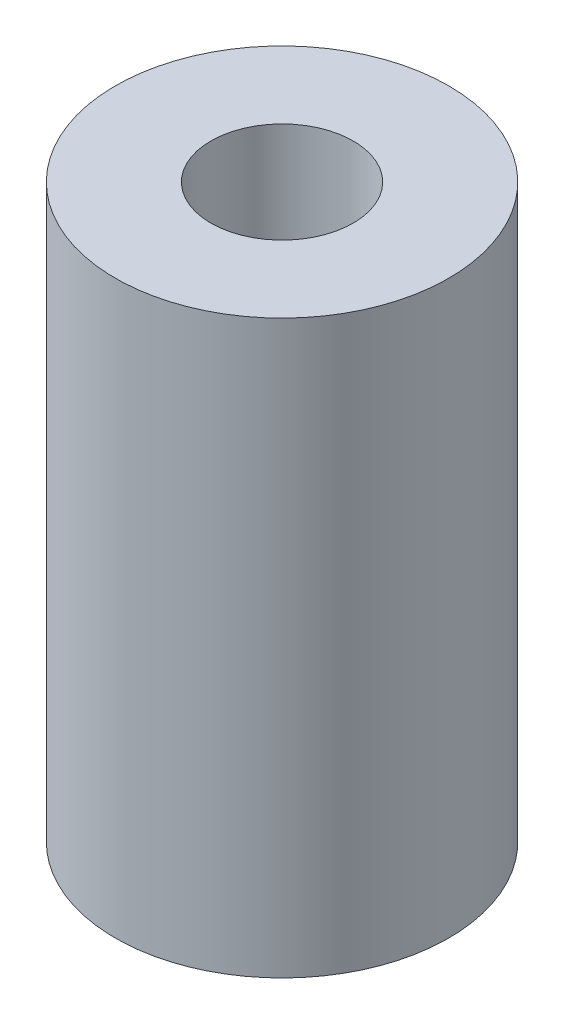
ISO-10303-21;
HEADER;
FILE_DESCRIPTION(('STEP AP214'),'2;1');
FILE_NAME('part.step','',(''),(''),'','','');
FILE_SCHEMA(('AUTOMOTIVE_DESIGN { 1 0 10303 214 1 1 1 1 }'));
ENDSEC;
DATA;
#1=APPLICATION_CONTEXT('core data for automotive mechanical design processes');
#2=APPLICATION_PROTOCOL_DEFINITION('international standard','automotive_design',2000,#1);
#3=PRODUCT_CONTEXT('',#1,'mechanical');
#4=PRODUCT('Part','Part','',(#3));
#5=PRODUCT_RELATED_PRODUCT_CATEGORY('part','',(#4));
#6=PRODUCT_DEFINITION_FORMATION('','',#4);
#7=PRODUCT_DEFINITION_CONTEXT('part definition',#1,'design');
#8=PRODUCT_DEFINITION('design','',#6,#7);
#9=PRODUCT_DEFINITION_SHAPE('','',#8);
#10=(LENGTH_UNIT() NAMED_UNIT(*) SI_UNIT(.MILLI.,.METRE.));
#11=(NAMED_UNIT(*) PLANE_ANGLE_UNIT() SI_UNIT($,.RADIAN.));
#12=(NAMED_UNIT(*) SI_UNIT($,.STERADIAN.) SOLID_ANGLE_UNIT());
#13=UNCERTAINTY_MEASURE_WITH_UNIT(LENGTH_MEASURE(1.E-05),#10,'distance_accuracy_value','');
#14=(GEOMETRIC_REPRESENTATION_CONTEXT(3) GLOBAL_UNCERTAINTY_ASSIGNED_CONTEXT((#13)) GLOBAL_UNIT_ASSIGNED_CONTEXT((#10,
#11,#12)) REPRESENTATION_CONTEXT('',''));
#15=CARTESIAN_POINT('',(0.,0.,0.));
#16=DIRECTION('',(0.,0.,1.));
#17=DIRECTION('',(1.,0.,0.));
#18=AXIS2_PLACEMENT_3D('',#15,#16,#17);
#19=CARTESIAN_POINT('',(0.,15.24,0.));
#20=DIRECTION('',(0.,-1.,0.));
#21=DIRECTION('',(0.,0.,-1.));
#22=AXIS2_PLACEMENT_3D('',#19,#20,#21);
#23=CYLINDRICAL_SURFACE('',#22,4.445);
#24=CARTESIAN_POINT('',(0.,15.24,0.));
#25=DIRECTION('',(0.,1.,0.));
#26=DIRECTION('',(0.,0.,1.));
#27=AXIS2_PLACEMENT_3D('',#24,#25,#26);
#28=CIRCLE('',#27,4.445);
#29=CARTESIAN_POINT('',(0.,15.24,-4.445));
#30=VERTEX_POINT('',#29);
#31=EDGE_CURVE('E10',#30,#30,#28,.T.);
#32=CARTESIAN_POINT('',(0.,0.,0.));
#33=DIRECTION('',(0.,1.,0.));
#34=DIRECTION('',(0.,0.,1.));
#35=AXIS2_PLACEMENT_3D('',#32,#33,#34);
#36=CIRCLE('',#35,4.445);
#37=CARTESIAN_POINT('',(0.,0.,-4.445));
#38=VERTEX_POINT('',#37);
#39=EDGE_CURVE('E42',#38,#38,#36,.T.);
#40=CARTESIAN_POINT('',(0.,15.24,-4.445));
#41=CARTESIAN_POINT('',(0.,15.08125,-4.445));
#42=CARTESIAN_POINT('',(0.,14.9225,-4.445));
#43=CARTESIAN_POINT('',(0.,14.605,-4.445));
#44=CARTESIAN_POINT('',(0.,14.44625,-4.445));
#45=CARTESIAN_POINT('',(0.,14.12875,-4.445));
#46=CARTESIAN_POINT('',(0.,13.97,-4.445));
#47=CARTESIAN_POINT('',(0.,13.6525,-4.445));
#48=CARTESIAN_POINT('',(0.,13.49375,-4.445));
#49=CARTESIAN_POINT('',(0.,13.17625,-4.445));
#50=CARTESIAN_POINT('',(0.,13.0175,-4.445));
#51=CARTESIAN_POINT('',(0.,12.7,-4.445));
#52=CARTESIAN_POINT('',(0.,12.54125,-4.445));
#53=CARTESIAN_POINT('',(0.,12.22375,-4.445));
#54=CARTESIAN_POINT('',(0.,12.065,-4.445));
#55=CARTESIAN_POINT('',(0.,11.7475,-4.445));
#56=CARTESIAN_POINT('',(0.,11.58875,-4.445));
#57=CARTESIAN_POINT('',(0.,11.27125,-4.445));
#58=CARTESIAN_POINT('',(0.,11.1125,-4.445));
#59=CARTESIAN_POINT('',(0.,10.795,-4.445));
#60=CARTESIAN_POINT('',(0.,10.63625,-4.445));
#61=CARTESIAN_POINT('',(0.,10.31875,-4.445));
#62=CARTESIAN_POINT('',(0.,10.16,-4.445));
#63=CARTESIAN_POINT('',(0.,9.8425,-4.445));
#64=CARTESIAN_POINT('',(0.,9.68375,-4.445));
#65=CARTESIAN_POINT('',(0.,9.36625,-4.445));
#66=CARTESIAN_POINT('',(0.,9.2075,-4.445));
#67=CARTESIAN_POINT('',(0.,8.89,-4.445));
#68=CARTESIAN_POINT('',(0.,8.73125,-4.445));
#69=CARTESIAN_POINT('',(0.,8.41375,-4.445));
#70=CARTESIAN_POINT('',(0.,8.255,-4.445));
#71=CARTESIAN_POINT('',(0.,7.9375,-4.445));
#72=CARTESIAN_POINT('',(0.,7.77875,-4.445));
#73=CARTESIAN_POINT('',(0.,7.46125,-4.445));
#74=CARTESIAN_POINT('',(0.,7.3025,-4.445));
#75=CARTESIAN_POINT('',(0.,6.985,-4.445));
#76=CARTESIAN_POINT('',(0.,6.82625,-4.445));
#77=CARTESIAN_POINT('',(0.,6.50875,-4.445));
#78=CARTESIAN_POINT('',(0.,6.35,-4.445));
#79=CARTESIAN_POINT('',(0.,6.0325,-4.445));
#80=CARTESIAN_POINT('',(0.,5.87375,-4.445));
#81=CARTESIAN_POINT('',(0.,5.55625,-4.445));
#82=CARTESIAN_POINT('',(0.,5.3975,-4.445));
#83=CARTESIAN_POINT('',(0.,5.08,-4.445));
#84=CARTESIAN_POINT('',(0.,4.92125,-4.445));
#85=CARTESIAN_POINT('',(0.,4.60375,-4.445));
#86=CARTESIAN_POINT('',(0.,4.445,-4.445));
#87=CARTESIAN_POINT('',(0.,4.1275,-4.445));
#88=CARTESIAN_POINT('',(0.,3.96875,-4.445));
#89=CARTESIAN_POINT('',(0.,3.65125,-4.445));
#90=CARTESIAN_POINT('',(0.,3.4925,-4.445));
#91=CARTESIAN_POINT('',(0.,3.175,-4.445));
#92=CARTESIAN_POINT('',(0.,3.01625,-4.445));
#93=CARTESIAN_POINT('',(0.,2.69875,-4.445));
#94=CARTESIAN_POINT('',(0.,2.54,-4.445));
#95=CARTESIAN_POINT('',(0.,2.2225,-4.445));
#96=CARTESIAN_POINT('',(0.,2.06375,-4.445));
#97=CARTESIAN_POINT('',(0.,1.74625,-4.445));
#98=CARTESIAN_POINT('',(0.,1.5875,-4.445));
#99=CARTESIAN_POINT('',(0.,1.27,-4.445));
#100=CARTESIAN_POINT('',(0.,1.11125,-4.445));
#101=CARTESIAN_POINT('',(0.,0.79375,-4.445));
#102=CARTESIAN_POINT('',(0.,0.634999999999999,-4.445));
#103=CARTESIAN_POINT('',(0.,0.3175,-4.445));
#104=CARTESIAN_POINT('',(0.,0.15875,-4.445));
#105=CARTESIAN_POINT('',(0.,0.,-4.445));
#106=B_SPLINE_CURVE_WITH_KNOTS('',3,(#40,#41,#42,#43,#44,#45,#46,#47,#48,#49,#50,#51,#52,#53,
#54,#55,#56,#57,#58,#59,#60,#61,#62,#63,#64,#65,#66,#67,#68,#69,#70,#71,#72,#73,#74,#75,#76,#77,
#78,#79,#80,#81,#82,#83,#84,#85,#86,#87,#88,#89,#90,#91,#92,#93,#94,#95,#96,#97,#98,#99,#100,
#101,#102,#103,#104,#105),.UNSPECIFIED.,.F.,.F.,(4,2,2,2,2,2,2,2,2,2,2,2,2,2,2,2,2,2,2,2,2,2,2,
2,2,2,2,2,2,2,2,2,4),(0.,0.476249999999999,0.952499999999998,1.42875,1.905,2.38125,2.8575,
3.33375,3.81,4.28625,4.7625,5.23875,5.715,6.19125,6.6675,7.14375,7.62,8.09625,8.5725,9.04875,
9.525,10.00125,10.4775,10.95375,11.43,11.90625,12.3825,12.85875,13.335,13.81125,14.2875,
14.76375,15.24),.UNSPECIFIED.);
#107=EDGE_CURVE('BSEAM39',#30,#38,#106,.T.);
#108=ORIENTED_EDGE('',*,*,#31,.F.);
#109=ORIENTED_EDGE('',*,*,#39,.T.);
#110=ORIENTED_EDGE('',*,*,#107,.T.);
#111=ORIENTED_EDGE('',*,*,#107,.F.);
#112=EDGE_LOOP('',(#108,#110,#109,#111));
#113=FACE_BOUND('',#112,.T.);
#114=ADVANCED_FACE('F39',(#113),#23,.T.);
#115=CARTESIAN_POINT('',(0.,15.24,0.));
#116=DIRECTION('',(0.,1.,0.));
#117=DIRECTION('',(0.,0.,1.));
#118=AXIS2_PLACEMENT_3D('',#115,#116,#117);
#119=PLANE('',#118);
#120=CARTESIAN_POINT('',(0.,15.24,0.));
#121=DIRECTION('',(0.,1.,0.));
#122=DIRECTION('',(0.,0.,1.));
#123=AXIS2_PLACEMENT_3D('',#120,#121,#122);
#124=CIRCLE('',#123,1.89864999999999);
#125=CARTESIAN_POINT('',(0.,15.24,1.89864999999999));
#126=VERTEX_POINT('',#125);
#127=EDGE_CURVE('E53',#126,#126,#124,.T.);
#128=ORIENTED_EDGE('',*,*,#127,.F.);
#129=EDGE_LOOP('',(#128));
#130=FACE_BOUND('',#129,.T.);
#131=ORIENTED_EDGE('',*,*,#31,.T.);
#132=EDGE_LOOP('',(#131));
#133=FACE_BOUND('',#132,.T.);
#134=ADVANCED_FACE('F59',(#130,#133),#119,.T.);
#135=CARTESIAN_POINT('',(0.,0.,0.));
#136=DIRECTION('',(0.,1.,0.));
#137=DIRECTION('',(0.,0.,1.));
#138=AXIS2_PLACEMENT_3D('',#135,#136,#137);
#139=PLANE('',#138);
#140=CARTESIAN_POINT('',(0.,0.,0.));
#141=DIRECTION('',(0.,1.,0.));
#142=DIRECTION('',(0.,0.,1.));
#143=AXIS2_PLACEMENT_3D('',#140,#141,#142);
#144=CIRCLE('',#143,1.89865);
#145=CARTESIAN_POINT('',(0.,0.,1.89865));
#146=VERTEX_POINT('',#145);
#147=EDGE_CURVE('E49',#146,#146,#144,.T.);
#148=ORIENTED_EDGE('',*,*,#147,.T.);
#149=EDGE_LOOP('',(#148));
#150=FACE_BOUND('',#149,.T.);
#151=ORIENTED_EDGE('',*,*,#39,.F.);
#152=EDGE_LOOP('',(#151));
#153=FACE_BOUND('',#152,.T.);
#154=ADVANCED_FACE('F61',(#150,#153),#139,.F.);
#155=CARTESIAN_POINT('',(0.,15.24,0.));
#156=DIRECTION('',(0.,1.,0.));
#157=DIRECTION('',(0.,0.,1.));
#158=AXIS2_PLACEMENT_3D('',#155,#156,#157);
#159=CYLINDRICAL_SURFACE('',#158,1.89864999999999);
#160=ORIENTED_EDGE('',*,*,#147,.F.);
#161=EDGE_LOOP('',(#160));
#162=FACE_BOUND('',#161,.T.);
#163=ORIENTED_EDGE('',*,*,#127,.T.);
#164=EDGE_LOOP('',(#163));
#165=FACE_BOUND('',#164,.T.);
#166=ADVANCED_FACE('F57',(#162,#165),#159,.F.);
#167=CLOSED_SHELL('',(#114,#134,#154,#166));
#168=MANIFOLD_SOLID_BREP('B2',#167);
#169=ADVANCED_BREP_SHAPE_REPRESENTATION('',(#18,#168),#14);
#170=SHAPE_DEFINITION_REPRESENTATION(#9,#169);
ENDSEC;
END-ISO-10303-21;
